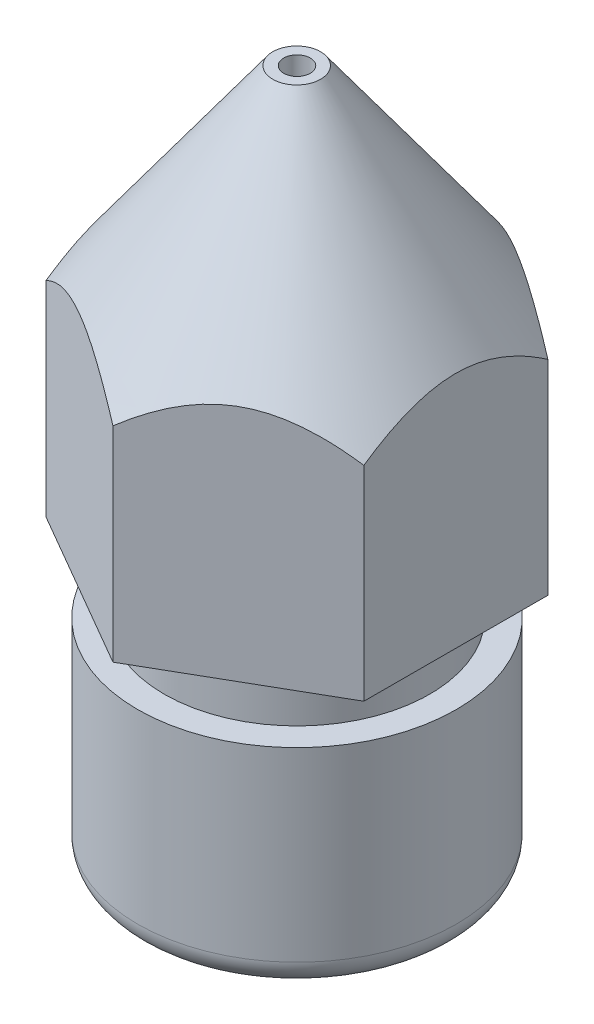
ISO-10303-21;
HEADER;
FILE_DESCRIPTION(('STEP AP214'),'2;1');
FILE_NAME('part.step','',(''),(''),'','','');
FILE_SCHEMA(('AUTOMOTIVE_DESIGN { 1 0 10303 214 1 1 1 1 }'));
ENDSEC;
DATA;
#1=APPLICATION_CONTEXT('core data for automotive mechanical design processes');
#2=APPLICATION_PROTOCOL_DEFINITION('international standard','automotive_design',2000,#1);
#3=PRODUCT_CONTEXT('',#1,'mechanical');
#4=PRODUCT('Part','Part','',(#3));
#5=PRODUCT_RELATED_PRODUCT_CATEGORY('part','',(#4));
#6=PRODUCT_DEFINITION_FORMATION('','',#4);
#7=PRODUCT_DEFINITION_CONTEXT('part definition',#1,'design');
#8=PRODUCT_DEFINITION('design','',#6,#7);
#9=PRODUCT_DEFINITION_SHAPE('','',#8);
#10=(LENGTH_UNIT() NAMED_UNIT(*) SI_UNIT(.MILLI.,.METRE.));
#11=(NAMED_UNIT(*) PLANE_ANGLE_UNIT() SI_UNIT($,.RADIAN.));
#12=(NAMED_UNIT(*) SI_UNIT($,.STERADIAN.) SOLID_ANGLE_UNIT());
#13=UNCERTAINTY_MEASURE_WITH_UNIT(LENGTH_MEASURE(1.E-05),#10,'distance_accuracy_value','');
#14=(GEOMETRIC_REPRESENTATION_CONTEXT(3) GLOBAL_UNCERTAINTY_ASSIGNED_CONTEXT((#13)) GLOBAL_UNIT_ASSIGNED_CONTEXT((#10,
#11,#12)) REPRESENTATION_CONTEXT('',''));
#15=CARTESIAN_POINT('',(0.,0.,0.));
#16=DIRECTION('',(0.,0.,1.));
#17=DIRECTION('',(1.,0.,0.));
#18=AXIS2_PLACEMENT_3D('',#15,#16,#17);
#19=CARTESIAN_POINT('',(-2.99360370897873,8.,-1.73491695293717));
#20=DIRECTION('',(0.999998652401006,0.,0.00164170526315273));
#21=DIRECTION('',(0.00164170526315273,0.,-0.999998652401006));
#22=AXIS2_PLACEMENT_3D('',#19,#20,#21);
#23=PLANE('',#22);
#24=DIRECTION('',(0.,-1.,0.));
#25=VECTOR('',#24,1.);
#26=CARTESIAN_POINT('',(-2.99928400918924,8.,1.72507838437032));
#27=LINE('',#26,#25);
#28=CARTESIAN_POINT('',(-2.99928400918924,3.86047640121463,1.72507838437032));
#29=VERTEX_POINT('',#28);
#30=CARTESIAN_POINT('',(-2.99928400918924,0.,1.72507838437032));
#31=VERTEX_POINT('',#30);
#32=EDGE_CURVE('E105',#29,#31,#27,.T.);
#33=ORIENTED_EDGE('',*,*,#32,.F.);
#34=CARTESIAN_POINT('',(-2.99928433753074,3.86033844854148,1.72527838437032));
#35=CARTESIAN_POINT('',(-2.99916196732492,3.91171394311012,1.65074001036501));
#36=CARTESIAN_POINT('',(-2.99903767415675,3.96148610351317,1.57503031785113));
#37=CARTESIAN_POINT('',(-2.99878439440269,4.05693383779429,1.42075206923493));
#38=CARTESIAN_POINT('',(-2.99865539426693,4.10259601480475,1.34217525961372));
#39=CARTESIAN_POINT('',(-2.99839003152426,4.18944362627375,1.18053699784877));
#40=CARTESIAN_POINT('',(-2.99825357396874,4.23052322601689,1.09741771042752));
#41=CARTESIAN_POINT('',(-2.99797571892827,4.30563377056149,0.928170116309737));
#42=CARTESIAN_POINT('',(-2.99783432761016,4.3396731705751,0.842045565978357));
#43=CARTESIAN_POINT('',(-2.99748526575783,4.41170138747353,0.629424342321209));
#44=CARTESIAN_POINT('',(-2.99727494700448,4.44522885295508,0.501314580691445));
#45=CARTESIAN_POINT('',(-2.99695583152763,4.47867661143214,0.306934350594162));
#46=CARTESIAN_POINT('',(-2.99684931534527,4.48701836542872,0.242053009705562));
#47=CARTESIAN_POINT('',(-2.9966354650866,4.49790218774536,0.111792130794857));
#48=CARTESIAN_POINT('',(-2.99652813106352,4.50044463038232,0.0464126252001419));
#49=CARTESIAN_POINT('',(-2.99631328690847,4.49959864630073,-0.0844536577726145));
#50=CARTESIAN_POINT('',(-2.99620577691863,4.49619695970321,-0.149940348576431));
#51=CARTESIAN_POINT('',(-2.99599169701284,4.48360647941934,-0.28034111057682));
#52=CARTESIAN_POINT('',(-2.99588512716476,4.47441727133541,-0.345255140432258));
#53=CARTESIAN_POINT('',(-2.99556600931188,4.43848348707277,-0.539636817826061));
#54=CARTESIAN_POINT('',(-2.99535590104619,4.40338935230215,-0.667618366810548));
#55=CARTESIAN_POINT('',(-2.99501154116324,4.32985662326248,-0.877375517877618));
#56=CARTESIAN_POINT('',(-2.99487444769295,4.2960453210109,-0.960882154920629));
#57=CARTESIAN_POINT('',(-2.99460493326128,4.22188764735797,-1.12504930143273));
#58=CARTESIAN_POINT('',(-2.99447251740218,4.18153439280243,-1.20570670299829));
#59=CARTESIAN_POINT('',(-2.99421487754598,4.09648315507799,-1.36264078537093));
#60=CARTESIAN_POINT('',(-2.99408956403016,4.0518841682177,-1.438971994));
#61=CARTESIAN_POINT('',(-2.99384336185241,3.95879877905163,-1.58893913578326));
#62=CARTESIAN_POINT('',(-2.99372246175059,3.9103236475861,-1.66258203722871));
#63=CARTESIAN_POINT('',(-2.99360338063724,3.86032558334046,-1.73511695293717));
#64=B_SPLINE_CURVE_WITH_KNOTS('',3,(#34,#35,#36,#37,#38,#39,#40,#41,#42,#43,#44,#45,#46,#47,#48,
#49,#50,#51,#52,#53,#54,#55,#56,#57,#58,#59,#60,#61,#62,#63),.UNSPECIFIED.,.F.,.F.,(4,2,2,2,2,2,
2,2,2,2,2,2,2,2,4),(0.,0.271643738950358,0.544143079042052,0.822007262643274,1.09953577099785,
1.49491928661063,1.69094610145264,1.88696026337387,2.08341224269272,2.27987828994745,
2.67614233177217,2.94616461375648,3.21647286749803,3.48155904967933,3.74590065712568),.UNSPECIFIED.);
#65=CARTESIAN_POINT('',(-2.99360370897873,3.86046353712789,-1.73491695293717));
#66=VERTEX_POINT('',#65);
#67=EDGE_CURVE('E98',#29,#66,#64,.T.);
#68=ORIENTED_EDGE('',*,*,#67,.T.);
#69=DIRECTION('',(0.,-1.,0.));
#70=VECTOR('',#69,1.);
#71=CARTESIAN_POINT('',(-2.99360370897873,8.,-1.73491695293717));
#72=LINE('',#71,#70);
#73=CARTESIAN_POINT('',(-2.99360370897873,0.,-1.73491695293717));
#74=VERTEX_POINT('',#73);
#75=EDGE_CURVE('E67',#66,#74,#72,.T.);
#76=ORIENTED_EDGE('',*,*,#75,.T.);
#77=DIRECTION('',(-0.00164170526315273,0.,0.999998652401006));
#78=VECTOR('',#77,1.);
#79=CARTESIAN_POINT('',(-2.99360370897873,0.,-1.73491695293717));
#80=LINE('',#79,#78);
#81=EDGE_CURVE('E106',#74,#31,#80,.T.);
#82=ORIENTED_EDGE('',*,*,#81,.T.);
#83=EDGE_LOOP('',(#33,#68,#76,#82));
#84=FACE_BOUND('',#83,.T.);
#85=ADVANCED_FACE('F43',(#84),#23,.F.);
#86=CARTESIAN_POINT('',(-2.99928400918924,8.,1.72507838437032));
#87=DIRECTION('',(0.50142108466392,0.,-0.8652033840979));
#88=DIRECTION('',(-0.8652033840979,0.,-0.50142108466392));
#89=AXIS2_PLACEMENT_3D('',#86,#87,#88);
#90=PLANE('',#89);
#91=DIRECTION('',(0.,-1.,0.));
#92=VECTOR('',#91,1.);
#93=CARTESIAN_POINT('',(-0.00568030021050791,8.,3.45999533730748));
#94=LINE('',#93,#92);
#95=CARTESIAN_POINT('',(-0.0056803002105078,3.85370164646345,3.45999533730748));
#96=VERTEX_POINT('',#95);
#97=CARTESIAN_POINT('',(-0.00568030021050791,0.,3.45999533730748));
#98=VERTEX_POINT('',#97);
#99=EDGE_CURVE('E124',#96,#98,#94,.T.);
#100=ORIENTED_EDGE('',*,*,#99,.F.);
#101=CARTESIAN_POINT('',(-0.00548030021050791,3.85354197372942,3.46011124556533));
#102=CARTESIAN_POINT('',(-0.070028430534204,3.90503676585917,3.42270293890032));
#103=CARTESIAN_POINT('',(-0.135589644430771,3.95493080769913,3.3847075084754));
#104=CARTESIAN_POINT('',(-0.26918561975504,4.05062877498785,3.30728312470039));
#105=CARTESIAN_POINT('',(-0.337227501214842,4.09641936660326,3.26785004499773));
#106=CARTESIAN_POINT('',(-0.477199787077993,4.18353796793565,3.18673032599251));
#107=CARTESIAN_POINT('',(-0.549180470158288,4.22475987101522,3.14501454812069));
#108=CARTESIAN_POINT('',(-0.695750398189047,4.30016279366352,3.06007122306779));
#109=CARTESIAN_POINT('',(-0.770336399055366,4.33435222828287,3.01684555596742));
#110=CARTESIAN_POINT('',(-0.954477355004354,4.40675112814688,2.91012826895719));
#111=CARTESIAN_POINT('',(-1.06543243471238,4.44050281819844,2.84582521901689));
#112=CARTESIAN_POINT('',(-1.23380410646683,4.47427944071376,2.74824688329896));
#113=CARTESIAN_POINT('',(-1.29000714555667,4.48272912449115,2.71567490156634));
#114=CARTESIAN_POINT('',(-1.40285229981434,4.49382220722695,2.65027647538479));
#115=CARTESIAN_POINT('',(-1.45949438615608,4.49646598419139,2.61745004764178));
#116=CARTESIAN_POINT('',(-1.57288478674166,4.49581163365098,2.55173562870041));
#117=CARTESIAN_POINT('',(-1.62963304058096,4.49249963164274,2.51884767250898));
#118=CARTESIAN_POINT('',(-1.74263977649679,4.48007235773911,2.45335560308496));
#119=CARTESIAN_POINT('',(-1.79889822337764,4.47095667224542,2.4207515102497));
#120=CARTESIAN_POINT('',(-1.96736588984063,4.43521712962939,2.32311754163463));
#121=CARTESIAN_POINT('',(-2.07829494006429,4.40021562008236,2.25882957685524));
#122=CARTESIAN_POINT('',(-2.25970827252633,4.32694006147513,2.15369306027717));
#123=CARTESIAN_POINT('',(-2.33170628464134,4.29335545736975,2.11196723951424));
#124=CARTESIAN_POINT('',(-2.47326102203411,4.21968730335707,2.0299304245094));
#125=CARTESIAN_POINT('',(-2.54281511714038,4.17959699772672,1.98962095456048));
#126=CARTESIAN_POINT('',(-2.67816502595343,4.09508205642632,1.91118009391016));
#127=CARTESIAN_POINT('',(-2.74400733557389,4.05075529652071,1.87302175690702));
#128=CARTESIAN_POINT('',(-2.87337522076163,3.95822430236718,1.7980477259407));
#129=CARTESIAN_POINT('',(-2.93690672870875,3.91003119158422,1.76122859391848));
#130=CARTESIAN_POINT('',(-2.99948400918924,3.86031740704726,1.72496247611247));
#131=B_SPLINE_CURVE_WITH_KNOTS('',3,(#101,#102,#103,#104,#105,#106,#107,#108,#109,#110,#111,
#112,#113,#114,#115,#116,#117,#118,#119,#120,#121,#122,#123,#124,#125,#126,#127,#128,#129,#130),
.UNSPECIFIED.,.F.,.F.,(4,2,2,2,2,2,2,2,2,2,2,2,2,2,4),(0.,0.272009967367018,0.544873980094565,
0.823131818723369,1.10105473180889,1.49699296322312,1.69329289617032,1.88958004821039,
2.086325060722,2.28308409579589,2.67992894083109,2.9488884582403,3.21812908017825,
3.48220588719126,3.74554846390116),.UNSPECIFIED.);
#132=EDGE_CURVE('E107',#96,#29,#131,.T.);
#133=ORIENTED_EDGE('',*,*,#132,.T.);
#134=ORIENTED_EDGE('',*,*,#32,.T.);
#135=DIRECTION('',(0.8652033840979,0.,0.50142108466392));
#136=VECTOR('',#135,1.);
#137=CARTESIAN_POINT('',(-2.99928400918924,0.,1.72507838437032));
#138=LINE('',#137,#136);
#139=EDGE_CURVE('E243',#31,#98,#138,.T.);
#140=ORIENTED_EDGE('',*,*,#139,.T.);
#141=EDGE_LOOP('',(#100,#133,#134,#140));
#142=FACE_BOUND('',#141,.T.);
#143=ADVANCED_FACE('F152',(#142),#90,.F.);
#144=CARTESIAN_POINT('',(-0.00568030021050791,8.,3.45999533730748));
#145=DIRECTION('',(-0.498577567737086,0.,-0.866845089361053));
#146=DIRECTION('',(-0.866845089361053,0.,0.498577567737086));
#147=AXIS2_PLACEMENT_3D('',#144,#145,#146);
#148=PLANE('',#147);
#149=DIRECTION('',(0.,-1.,0.));
#150=VECTOR('',#149,1.);
#151=CARTESIAN_POINT('',(2.99360370897873,8.,1.73491695293716));
#152=LINE('',#151,#150);
#153=CARTESIAN_POINT('',(2.99360370897873,3.84692368025163,1.73491695293716));
#154=VERTEX_POINT('',#153);
#155=CARTESIAN_POINT('',(2.99360370897873,0.,1.73491695293716));
#156=VERTEX_POINT('',#155);
#157=EDGE_CURVE('E122',#154,#156,#152,.T.);
#158=ORIENTED_EDGE('',*,*,#157,.F.);
#159=CARTESIAN_POINT('',(2.99380370897873,3.84676453538978,1.73480192025743));
#160=CARTESIAN_POINT('',(2.92900575210707,3.89828772383083,1.77207133336008));
#161=CARTESIAN_POINT('',(2.86318954166741,3.94820302709815,1.80992640864564));
#162=CARTESIAN_POINT('',(2.72907183739772,4.04392539690487,1.88706600325827));
#163=CARTESIAN_POINT('',(2.66076316878563,4.0897190289211,1.92635464925739));
#164=CARTESIAN_POINT('',(2.5202488462862,4.1768158122958,2.00717334455118));
#165=CARTESIAN_POINT('',(2.44799297536457,4.21801295658777,2.04873227684597));
#166=CARTESIAN_POINT('',(2.30086548401587,4.29333884862904,2.13335462481124));
#167=CARTESIAN_POINT('',(2.22599712888708,4.32747607496498,2.17641616240165));
#168=CARTESIAN_POINT('',(2.04116469041631,4.39971207285934,2.28272501590118));
#169=CARTESIAN_POINT('',(1.92979832127418,4.43333698135214,2.34677887527705));
#170=CARTESIAN_POINT('',(1.76082124649981,4.46688372383056,2.44396830390545));
#171=CARTESIAN_POINT('',(1.70441822473081,4.47525060312185,2.47640925760265));
#172=CARTESIAN_POINT('',(1.59117899037932,4.48616802706839,2.54154032049763));
#173=CARTESIAN_POINT('',(1.5343428059967,4.4887189471646,2.57423041347587));
#174=CARTESIAN_POINT('',(1.42057579316376,4.48787282556438,2.63966503523599));
#175=CARTESIAN_POINT('',(1.36364504049381,4.4844623512676,2.67240952043178));
#176=CARTESIAN_POINT('',(1.25028135918194,4.47183733782787,2.73761216066344));
#177=CARTESIAN_POINT('',(1.19384846640334,4.46262238396582,2.77007029507205));
#178=CARTESIAN_POINT('',(1.02487012846659,4.42658832929142,2.86726045022522));
#179=CARTESIAN_POINT('',(0.913616069712732,4.39139654122133,2.93124971277646));
#180=CARTESIAN_POINT('',(0.732102038849708,4.31799296895117,3.03564993967807));
#181=CARTESIAN_POINT('',(0.660307708916944,4.28451074702711,3.07694341048907));
#182=CARTESIAN_POINT('',(0.519139307136593,4.21112319329572,3.15813830824509));
#183=CARTESIAN_POINT('',(0.449767777876186,4.17121134665984,3.19803827278703));
#184=CARTESIAN_POINT('',(0.314751057449613,4.08709753501789,3.27569494858793));
#185=CARTESIAN_POINT('',(0.249060026629975,4.04299193142097,3.31347802513779));
#186=CARTESIAN_POINT('',(0.119973837191925,3.95093495182471,3.38772367657928));
#187=CARTESIAN_POINT('',(0.056572912749971,3.90299437751896,3.42418956776159));
#188=CARTESIAN_POINT('',(-0.00588030021050773,3.85354317984692,3.46011036998722));
#189=B_SPLINE_CURVE_WITH_KNOTS('',3,(#159,#160,#161,#162,#163,#164,#165,#166,#167,#168,#169,
#170,#171,#172,#173,#174,#175,#176,#177,#178,#179,#180,#181,#182,#183,#184,#185,#186,#187,#188),
.UNSPECIFIED.,.F.,.F.,(4,2,2,2,2,2,2,2,2,2,2,2,2,2,4),(0.,0.272421514922281,0.545701052462781,
0.824354319672369,1.10267097049094,1.4991775487318,1.69576555176471,1.89234086397987,
2.08935968359733,2.28639258143396,2.68377412008408,2.95153275833444,3.21956442997652,
3.48248315533902,3.74468578415281),.UNSPECIFIED.);
#190=EDGE_CURVE('E212',#154,#96,#189,.T.);
#191=ORIENTED_EDGE('',*,*,#190,.T.);
#192=ORIENTED_EDGE('',*,*,#99,.T.);
#193=DIRECTION('',(0.866845089361053,0.,-0.498577567737086));
#194=VECTOR('',#193,1.);
#195=CARTESIAN_POINT('',(-0.00568030021050791,0.,3.45999533730748));
#196=LINE('',#195,#194);
#197=EDGE_CURVE('E244',#98,#156,#196,.T.);
#198=ORIENTED_EDGE('',*,*,#197,.T.);
#199=EDGE_LOOP('',(#158,#191,#192,#198));
#200=FACE_BOUND('',#199,.T.);
#201=ADVANCED_FACE('F157',(#200),#148,.F.);
#202=CARTESIAN_POINT('',(2.99360370897873,8.,1.73491695293716));
#203=DIRECTION('',(-0.999998652401006,0.,-0.00164170526315286));
#204=DIRECTION('',(-0.00164170526315286,0.,0.999998652401006));
#205=AXIS2_PLACEMENT_3D('',#202,#203,#204);
#206=PLANE('',#205);
#207=DIRECTION('',(0.,-1.,0.));
#208=VECTOR('',#207,1.);
#209=CARTESIAN_POINT('',(2.99928400918924,8.,-1.72507838437032));
#210=LINE('',#209,#208);
#211=CARTESIAN_POINT('',(2.99928400918924,3.84691085269213,-1.72507838437032));
#212=VERTEX_POINT('',#211);
#213=CARTESIAN_POINT('',(2.99928400918924,0.,-1.72507838437032));
#214=VERTEX_POINT('',#213);
#215=EDGE_CURVE('E115',#212,#214,#210,.T.);
#216=ORIENTED_EDGE('',*,*,#215,.F.);
#217=CARTESIAN_POINT('',(2.99928433753074,3.84677329060856,-1.72527838437032));
#218=CARTESIAN_POINT('',(2.99916148443503,3.89820547781602,-1.65044587155336));
#219=CARTESIAN_POINT('',(2.99903669606908,3.94802001471041,-1.57443454321443));
#220=CARTESIAN_POINT('',(2.99878239929559,4.04351615679581,-1.41953680578203));
#221=CARTESIAN_POINT('',(2.9986528771822,4.08918416304675,-1.34064204814536));
#222=CARTESIAN_POINT('',(2.99838646677774,4.17598748457118,-1.17836563262205));
#223=CARTESIAN_POINT('',(2.99824948414648,4.21701718192057,-1.09492651005879));
#224=CARTESIAN_POINT('',(2.99797057070069,4.29197288431364,-0.925034218071113));
#225=CARTESIAN_POINT('',(2.99782864610963,4.32590747199251,-0.838584839500404));
#226=CARTESIAN_POINT('',(2.99747828745966,4.39760940416004,-0.625173707983022));
#227=CARTESIAN_POINT('',(2.99726720713237,4.43088311091715,-0.496600054976437));
#228=CARTESIAN_POINT('',(2.99694700713983,4.4638710099451,-0.301559222601419));
#229=CARTESIAN_POINT('',(2.99684013691818,4.4720471460666,-0.236462228625682));
#230=CARTESIAN_POINT('',(2.99662560404858,4.4825797182801,-0.105785556441358));
#231=CARTESIAN_POINT('',(2.99651794145132,4.48493652349097,-0.0402059091120318));
#232=CARTESIAN_POINT('',(2.99630248468628,4.48370727315402,0.0910335280341329));
#233=CARTESIAN_POINT('',(2.99619469071106,4.48010883793801,0.156693200554096));
#234=CARTESIAN_POINT('',(2.99598006968698,4.4671232855758,0.287423569560417));
#235=CARTESIAN_POINT('',(2.99587324270825,4.45773575195998,0.35249422333081));
#236=CARTESIAN_POINT('',(2.99555339910957,4.42121352814261,0.54731796839547));
#237=CARTESIAN_POINT('',(2.99534285528393,4.38573913226365,0.675564826486311));
#238=CARTESIAN_POINT('',(2.99499941828758,4.31195236633105,0.884759827100979));
#239=CARTESIAN_POINT('',(2.99486361577613,4.27834787697069,0.967480112827471));
#240=CARTESIAN_POINT('',(2.99459658563699,4.20475546970431,1.13013402232446));
#241=CARTESIAN_POINT('',(2.99446536275961,4.1647611503495,1.21006475257754));
#242=CARTESIAN_POINT('',(2.99420995999332,4.08051579664291,1.36563617446392));
#243=CARTESIAN_POINT('',(2.9940856934378,4.03636070418735,1.44132965662777));
#244=CARTESIAN_POINT('',(2.99384148948096,3.94422632860382,1.59007963826641));
#245=CARTESIAN_POINT('',(2.99372154131362,3.89625767403018,1.66314269555725));
#246=CARTESIAN_POINT('',(2.99360338063724,3.84678611928128,1.73511695293716));
#247=B_SPLINE_CURVE_WITH_KNOTS('',3,(#217,#218,#219,#220,#221,#222,#223,#224,#225,#226,#227,
#228,#229,#230,#231,#232,#233,#234,#235,#236,#237,#238,#239,#240,#241,#242,#243,#244,#245,#246),
.UNSPECIFIED.,.F.,.F.,(4,2,2,2,2,2,2,2,2,2,2,2,2,2,4),(0.,0.27246781787684,0.545799172871012,
0.824454652288463,1.10277107919303,1.49929545175813,1.69590057911425,1.89249323553048,
2.08949507949232,2.28651109748441,2.68385283480933,2.95146812279911,3.21935321348763,
3.48211946169567,3.7441774474265),.UNSPECIFIED.);
#248=EDGE_CURVE('E206',#212,#154,#247,.T.);
#249=ORIENTED_EDGE('',*,*,#248,.T.);
#250=ORIENTED_EDGE('',*,*,#157,.T.);
#251=DIRECTION('',(0.00164170526315286,0.,-0.999998652401006));
#252=VECTOR('',#251,1.);
#253=CARTESIAN_POINT('',(2.99360370897873,0.,1.73491695293716));
#254=LINE('',#253,#252);
#255=EDGE_CURVE('E247',#156,#214,#254,.T.);
#256=ORIENTED_EDGE('',*,*,#255,.T.);
#257=EDGE_LOOP('',(#216,#249,#250,#256));
#258=FACE_BOUND('',#257,.T.);
#259=ADVANCED_FACE('F220',(#258),#206,.F.);
#260=CARTESIAN_POINT('',(2.99928400918924,8.,-1.72507838437032));
#261=DIRECTION('',(-0.50142108466392,0.,0.8652033840979));
#262=DIRECTION('',(0.8652033840979,0.,0.50142108466392));
#263=AXIS2_PLACEMENT_3D('',#260,#261,#262);
#264=PLANE('',#263);
#265=DIRECTION('',(0.,-1.,0.));
#266=VECTOR('',#265,1.);
#267=CARTESIAN_POINT('',(0.00568030021050907,8.,-3.45999533730748));
#268=LINE('',#267,#266);
#269=CARTESIAN_POINT('',(0.00568030021050907,3.85367595489511,-3.45999533730748));
#270=VERTEX_POINT('',#269);
#271=CARTESIAN_POINT('',(0.00568030021050907,0.,-3.45999533730748));
#272=VERTEX_POINT('',#271);
#273=EDGE_CURVE('E113',#270,#272,#268,.T.);
#274=ORIENTED_EDGE('',*,*,#273,.F.);
#275=CARTESIAN_POINT('',(0.00548030021050907,3.85351718757397,-3.46011124556533));
#276=CARTESIAN_POINT('',(0.0701687375371599,3.9048312847969,-3.42262162519894));
#277=CARTESIAN_POINT('',(0.135877416787921,3.95452517835206,-3.38454073251253));
#278=CARTESIAN_POINT('',(0.269782192646824,4.04977365330201,-3.30693738607757));
#279=CARTESIAN_POINT('',(0.337985532774358,4.09531457345514,-3.26741073441045));
#280=CARTESIAN_POINT('',(0.478265799399972,4.18184975834371,-3.18611252783709));
#281=CARTESIAN_POINT('',(0.550392202175507,4.22273868995759,-3.14431229938523));
#282=CARTESIAN_POINT('',(0.697247563762876,4.29740534503687,-3.05920355380095));
#283=CARTESIAN_POINT('',(0.771973237158301,4.33119169074862,-3.01589694070299));
#284=CARTESIAN_POINT('',(0.956438105759044,4.40252807110269,-2.90899193293697));
#285=CARTESIAN_POINT('',(1.067567471221,4.43558092472528,-2.84458787720613));
#286=CARTESIAN_POINT('',(1.23612609642327,4.46824536259874,-2.74690119424602));
#287=CARTESIAN_POINT('',(1.29238141932863,4.47631541352599,-2.71429891188356));
#288=CARTESIAN_POINT('',(1.40530178362981,4.48664247953031,-2.64885689837644));
#289=CARTESIAN_POINT('',(1.46196679904564,4.48889986002204,-2.61601718228826));
#290=CARTESIAN_POINT('',(1.57535303467751,4.487482821756,-2.55030517710953));
#291=CARTESIAN_POINT('',(1.63207414334706,4.48379662511239,-2.51743295266478));
#292=CARTESIAN_POINT('',(1.74500129643194,4.47065153285238,-2.4519870047772));
#293=CARTESIAN_POINT('',(1.80120730333827,4.46119222018303,-2.41941330307239));
#294=CARTESIAN_POINT('',(1.96948552507315,4.42448055773866,-2.32188912549928));
#295=CARTESIAN_POINT('',(2.08024916967987,4.3889161358026,-2.25769702010439));
#296=CARTESIAN_POINT('',(2.26132572907487,4.31487193223989,-2.15275567742376));
#297=CARTESIAN_POINT('',(2.33315570852978,4.28103810000573,-2.1111272385253));
#298=CARTESIAN_POINT('',(2.47438318063662,4.20694988283519,-2.02928008726619));
#299=CARTESIAN_POINT('',(2.54377811180581,4.16668897031007,-1.98906285939055));
#300=CARTESIAN_POINT('',(2.67882396617567,4.08189914328961,-1.91079821084424));
#301=CARTESIAN_POINT('',(2.74452124313272,4.03746728945272,-1.87272392625783));
#302=CARTESIAN_POINT('',(2.87361870453504,3.94476872202637,-1.79790661704076));
#303=CARTESIAN_POINT('',(2.93702465896928,3.89651278469559,-1.76116024846325));
#304=CARTESIAN_POINT('',(2.99948400918924,3.84675140712665,-1.72496247611247));
#305=B_SPLINE_CURVE_WITH_KNOTS('',3,(#275,#276,#277,#278,#279,#280,#281,#282,#283,#284,#285,
#286,#287,#288,#289,#290,#291,#292,#293,#294,#295,#296,#297,#298,#299,#300,#301,#302,#303,#304),
.UNSPECIFIED.,.F.,.F.,(4,2,2,2,2,2,2,2,2,2,2,2,2,2,4),(0.,0.272104563109087,0.545074156382199,
0.82333885069935,1.10126376715198,1.49724093262273,1.69357668988459,1.88990010415918,
2.08661303434878,2.28334017686645,2.68010936898421,2.94881581567372,3.21779692785262,
3.48160096565517,3.74468637482334),.UNSPECIFIED.);
#306=EDGE_CURVE('E59',#270,#212,#305,.T.);
#307=ORIENTED_EDGE('',*,*,#306,.T.);
#308=ORIENTED_EDGE('',*,*,#215,.T.);
#309=DIRECTION('',(-0.8652033840979,0.,-0.50142108466392));
#310=VECTOR('',#309,1.);
#311=CARTESIAN_POINT('',(2.99928400918924,0.,-1.72507838437032));
#312=LINE('',#311,#310);
#313=EDGE_CURVE('E117',#214,#272,#312,.T.);
#314=ORIENTED_EDGE('',*,*,#313,.T.);
#315=EDGE_LOOP('',(#274,#307,#308,#314));
#316=FACE_BOUND('',#315,.T.);
#317=ADVANCED_FACE('F224',(#316),#264,.F.);
#318=CARTESIAN_POINT('',(0.00568030021050907,8.,-3.45999533730748));
#319=DIRECTION('',(0.498577567737086,0.,0.866845089361053));
#320=DIRECTION('',(0.866845089361053,0.,-0.498577567737086));
#321=AXIS2_PLACEMENT_3D('',#318,#319,#320);
#322=PLANE('',#321);
#323=ORIENTED_EDGE('',*,*,#75,.F.);
#324=CARTESIAN_POINT('',(-2.99380370897873,3.86030484537906,-1.73480192025743));
#325=CARTESIAN_POINT('',(-2.92912014998105,3.91159064613409,-1.77200553589008));
#326=CARTESIAN_POINT('',(-2.86341766417013,3.96126342426315,-1.80979520093166));
#327=CARTESIAN_POINT('',(-2.72952757068096,4.05648789258607,-1.88680388215419));
#328=CARTESIAN_POINT('',(-2.66133274686644,4.1020260229103,-1.9260270487926));
#329=CARTESIAN_POINT('',(-2.52106303733564,4.18858367598292,-2.00670505166));
#330=CARTESIAN_POINT('',(-2.44893841731677,4.22949774846054,-2.04818849323948));
#331=CARTESIAN_POINT('',(-2.3020838036719,4.30424220885869,-2.13265389193718));
#332=CARTESIAN_POINT('',(-2.22735708685991,4.33808115514574,-2.17563396435192));
#333=CARTESIAN_POINT('',(-2.04288484709516,4.40958091354108,-2.28173564473949));
#334=CARTESIAN_POINT('',(-1.93174598173318,4.4427607427981,-2.34565865226795));
#335=CARTESIAN_POINT('',(-1.76315423733725,4.47565515903596,-2.44262645296627));
#336=CARTESIAN_POINT('',(-1.70688576998997,4.48380802321402,-2.47499001588496));
#337=CARTESIAN_POINT('',(-1.5939316108293,4.49431068102019,-2.53995711396431));
#338=CARTESIAN_POINT('',(-1.53724594570611,4.49666084269427,-2.57256063377373));
#339=CARTESIAN_POINT('',(-1.42380657256319,4.49543530221343,-2.63780680917619));
#340=CARTESIAN_POINT('',(-1.36705296489644,4.49184738387971,-2.67044940704988));
#341=CARTESIAN_POINT('',(-1.25405473511966,4.47889962883859,-2.73544185293456));
#342=CARTESIAN_POINT('',(-1.19781014999925,4.4695393760309,-2.76779167967048));
#343=CARTESIAN_POINT('',(-1.02940481866511,4.43312164951065,-2.86465226239862));
#344=CARTESIAN_POINT('',(-0.918546458808622,4.39774721617198,-2.92841393342719));
#345=CARTESIAN_POINT('',(-0.736882536787239,4.32382905555137,-3.03290037223687));
#346=CARTESIAN_POINT('',(-0.664574912085931,4.28989080099053,-3.07448907141148));
#347=CARTESIAN_POINT('',(-0.522422653917926,4.21551792549793,-3.15624984735125));
#348=CARTESIAN_POINT('',(-0.45258068008499,4.17507653609841,-3.19642039439242));
#349=CARTESIAN_POINT('',(-0.316687379858633,4.08988194921227,-3.2745812468102));
#350=CARTESIAN_POINT('',(-0.250588850190694,4.04522735252487,-3.3125987017826));
#351=CARTESIAN_POINT('',(-0.120718517810721,3.95205177498737,-3.38729536354364));
#352=CARTESIAN_POINT('',(-0.0569407561085322,3.90354189099687,-3.42397799772529));
#353=CARTESIAN_POINT('',(0.00588030021050923,3.85351658458047,-3.46011036998722));
#354=B_SPLINE_CURVE_WITH_KNOTS('',3,(#324,#325,#326,#327,#328,#329,#330,#331,#332,#333,#334,
#335,#336,#337,#338,#339,#340,#341,#342,#343,#344,#345,#346,#347,#348,#349,#350,#351,#352,#353),
.UNSPECIFIED.,.F.,.F.,(4,2,2,2,2,2,2,2,2,2,2,2,2,2,4),(0.,0.271692038552243,0.544245148801399,
0.82211397773886,1.09964471511733,1.49504938795877,1.69109491255205,1.8871280023154,
2.08356488477794,2.28001592910142,2.67624413612174,2.94615669359014,3.21635201651248,
3.48131790383246,3.74554697972579),.UNSPECIFIED.);
#355=EDGE_CURVE('E96',#66,#270,#354,.T.);
#356=ORIENTED_EDGE('',*,*,#355,.T.);
#357=ORIENTED_EDGE('',*,*,#273,.T.);
#358=DIRECTION('',(-0.866845089361053,0.,0.498577567737086));
#359=VECTOR('',#358,1.);
#360=CARTESIAN_POINT('',(0.00568030021050907,0.,-3.45999533730748));
#361=LINE('',#360,#359);
#362=EDGE_CURVE('E111',#272,#74,#361,.T.);
#363=ORIENTED_EDGE('',*,*,#362,.T.);
#364=EDGE_LOOP('',(#323,#356,#357,#363));
#365=FACE_BOUND('',#364,.T.);
#366=ADVANCED_FACE('F109',(#365),#322,.F.);
#367=CARTESIAN_POINT('',(0.,0.,0.));
#368=DIRECTION('',(0.,1.,0.));
#369=DIRECTION('',(0.,0.,1.));
#370=AXIS2_PLACEMENT_3D('',#367,#368,#369);
#371=PLANE('',#370);
#372=CARTESIAN_POINT('',(0.,0.,0.));
#373=DIRECTION('',(0.,-1.,0.));
#374=DIRECTION('',(0.,0.,-1.));
#375=AXIS2_PLACEMENT_3D('',#372,#373,#374);
#376=CIRCLE('',#375,2.5);
#377=CARTESIAN_POINT('',(0.,0.,-2.5));
#378=VERTEX_POINT('',#377);
#379=EDGE_CURVE('E127',#378,#378,#376,.T.);
#380=ORIENTED_EDGE('',*,*,#379,.F.);
#381=EDGE_LOOP('',(#380));
#382=FACE_BOUND('',#381,.T.);
#383=ORIENTED_EDGE('',*,*,#81,.F.);
#384=ORIENTED_EDGE('',*,*,#362,.F.);
#385=ORIENTED_EDGE('',*,*,#313,.F.);
#386=ORIENTED_EDGE('',*,*,#255,.F.);
#387=ORIENTED_EDGE('',*,*,#197,.F.);
#388=ORIENTED_EDGE('',*,*,#139,.F.);
#389=EDGE_LOOP('',(#383,#384,#385,#386,#387,#388));
#390=FACE_BOUND('',#389,.T.);
#391=ADVANCED_FACE('F183',(#382,#390),#371,.F.);
#392=CARTESIAN_POINT('',(-0.00568030021050791,2.85,0.));
#393=DIRECTION('',(0.,-1.,0.));
#394=DIRECTION('',(0.,0.,-1.));
#395=AXIS2_PLACEMENT_3D('',#392,#393,#394);
#396=CONICAL_SURFACE('',#395,4.18863013835261,0.627929034903158);
#397=CARTESIAN_POINT('',(-0.00568030021050791,8.,0.));
#398=DIRECTION('',(0.,1.,0.));
#399=DIRECTION('',(0.,0.,1.));
#400=AXIS2_PLACEMENT_3D('',#397,#398,#399);
#401=CIRCLE('',#400,0.45);
#402=CARTESIAN_POINT('',(-0.00568030021050791,8.,0.45));
#403=VERTEX_POINT('',#402);
#404=EDGE_CURVE('E102',#403,#403,#401,.T.);
#405=ORIENTED_EDGE('',*,*,#404,.F.);
#406=EDGE_LOOP('',(#405));
#407=FACE_BOUND('',#406,.T.);
#408=ORIENTED_EDGE('',*,*,#132,.F.);
#409=ORIENTED_EDGE('',*,*,#190,.F.);
#410=ORIENTED_EDGE('',*,*,#248,.F.);
#411=ORIENTED_EDGE('',*,*,#306,.F.);
#412=ORIENTED_EDGE('',*,*,#355,.F.);
#413=ORIENTED_EDGE('',*,*,#67,.F.);
#414=EDGE_LOOP('',(#408,#409,#410,#411,#412,#413));
#415=FACE_BOUND('',#414,.T.);
#416=ADVANCED_FACE('F97',(#407,#415),#396,.T.);
#417=CARTESIAN_POINT('',(0.,8.,0.));
#418=DIRECTION('',(0.,1.,0.));
#419=DIRECTION('',(0.,0.,1.));
#420=AXIS2_PLACEMENT_3D('',#417,#418,#419);
#421=PLANE('',#420);
#422=CARTESIAN_POINT('',(0.,8.,0.));
#423=DIRECTION('',(0.,1.,0.));
#424=DIRECTION('',(0.,0.,1.));
#425=AXIS2_PLACEMENT_3D('',#422,#423,#424);
#426=CIRCLE('',#425,0.25);
#427=CARTESIAN_POINT('',(0.,8.,0.25));
#428=VERTEX_POINT('',#427);
#429=EDGE_CURVE('E269',#428,#428,#426,.T.);
#430=ORIENTED_EDGE('',*,*,#429,.F.);
#431=EDGE_LOOP('',(#430));
#432=FACE_BOUND('',#431,.T.);
#433=ORIENTED_EDGE('',*,*,#404,.T.);
#434=EDGE_LOOP('',(#433));
#435=FACE_BOUND('',#434,.T.);
#436=ADVANCED_FACE('F182',(#432,#435),#421,.T.);
#437=CARTESIAN_POINT('',(0.,-1.,0.));
#438=DIRECTION('',(0.,1.,0.));
#439=DIRECTION('',(0.,0.,1.));
#440=AXIS2_PLACEMENT_3D('',#437,#438,#439);
#441=CYLINDRICAL_SURFACE('',#440,2.5);
#442=CARTESIAN_POINT('',(0.,-1.,0.));
#443=DIRECTION('',(0.,-1.,0.));
#444=DIRECTION('',(0.,0.,-1.));
#445=AXIS2_PLACEMENT_3D('',#442,#443,#444);
#446=CIRCLE('',#445,2.5);
#447=CARTESIAN_POINT('',(0.,-1.,-2.5));
#448=VERTEX_POINT('',#447);
#449=EDGE_CURVE('E259',#448,#448,#446,.T.);
#450=ORIENTED_EDGE('',*,*,#449,.F.);
#451=EDGE_LOOP('',(#450));
#452=FACE_BOUND('',#451,.T.);
#453=ORIENTED_EDGE('',*,*,#379,.T.);
#454=EDGE_LOOP('',(#453));
#455=FACE_BOUND('',#454,.T.);
#456=ADVANCED_FACE('F185',(#452,#455),#441,.T.);
#457=CARTESIAN_POINT('',(0.,-5.,0.));
#458=DIRECTION('',(0.,1.,0.));
#459=DIRECTION('',(0.,0.,1.));
#460=AXIS2_PLACEMENT_3D('',#457,#458,#459);
#461=CYLINDRICAL_SURFACE('',#460,3.);
#462=CARTESIAN_POINT('',(0.,-4.5,0.));
#463=DIRECTION('',(0.,-1.,0.));
#464=DIRECTION('',(0.,0.,-1.));
#465=AXIS2_PLACEMENT_3D('',#462,#463,#464);
#466=CIRCLE('',#465,3.);
#467=CARTESIAN_POINT('',(0.,-4.5,-3.));
#468=VERTEX_POINT('',#467);
#469=EDGE_CURVE('E131',#468,#468,#466,.F.);
#470=ORIENTED_EDGE('',*,*,#469,.T.);
#471=EDGE_LOOP('',(#470));
#472=FACE_BOUND('',#471,.T.);
#473=CARTESIAN_POINT('',(0.,-1.,0.));
#474=DIRECTION('',(0.,-1.,0.));
#475=DIRECTION('',(0.,0.,-1.));
#476=AXIS2_PLACEMENT_3D('',#473,#474,#475);
#477=CIRCLE('',#476,3.);
#478=CARTESIAN_POINT('',(0.,-1.,-3.));
#479=VERTEX_POINT('',#478);
#480=EDGE_CURVE('E265',#479,#479,#477,.T.);
#481=ORIENTED_EDGE('',*,*,#480,.T.);
#482=EDGE_LOOP('',(#481));
#483=FACE_BOUND('',#482,.T.);
#484=ADVANCED_FACE('F282',(#472,#483),#461,.T.);
#485=CARTESIAN_POINT('',(0.,-5.,0.));
#486=DIRECTION('',(0.,-1.,0.));
#487=DIRECTION('',(0.,0.,-1.));
#488=AXIS2_PLACEMENT_3D('',#485,#486,#487);
#489=PLANE('',#488);
#490=CARTESIAN_POINT('',(0.,-5.,0.));
#491=DIRECTION('',(0.,-1.,0.));
#492=DIRECTION('',(0.,0.,-1.));
#493=AXIS2_PLACEMENT_3D('',#490,#491,#492);
#494=CIRCLE('',#493,1.58359175109897);
#495=CARTESIAN_POINT('',(0.,-5.,-1.58359175109897));
#496=VERTEX_POINT('',#495);
#497=EDGE_CURVE('E52',#496,#496,#494,.F.);
#498=ORIENTED_EDGE('',*,*,#497,.T.);
#499=EDGE_LOOP('',(#498));
#500=FACE_BOUND('',#499,.T.);
#501=CARTESIAN_POINT('',(0.,-5.,0.));
#502=DIRECTION('',(0.,-1.,0.));
#503=DIRECTION('',(0.,0.,-1.));
#504=AXIS2_PLACEMENT_3D('',#501,#502,#503);
#505=CIRCLE('',#504,2.5);
#506=CARTESIAN_POINT('',(0.,-5.,-2.5));
#507=VERTEX_POINT('',#506);
#508=EDGE_CURVE('E128',#507,#507,#505,.T.);
#509=ORIENTED_EDGE('',*,*,#508,.T.);
#510=EDGE_LOOP('',(#509));
#511=FACE_BOUND('',#510,.T.);
#512=ADVANCED_FACE('F139',(#500,#511),#489,.T.);
#513=CARTESIAN_POINT('',(0.,-1.,0.));
#514=DIRECTION('',(0.,-1.,0.));
#515=DIRECTION('',(0.,0.,-1.));
#516=AXIS2_PLACEMENT_3D('',#513,#514,#515);
#517=PLANE('',#516);
#518=ORIENTED_EDGE('',*,*,#449,.T.);
#519=EDGE_LOOP('',(#518));
#520=FACE_BOUND('',#519,.T.);
#521=ORIENTED_EDGE('',*,*,#480,.F.);
#522=EDGE_LOOP('',(#521));
#523=FACE_BOUND('',#522,.T.);
#524=ADVANCED_FACE('F292',(#520,#523),#517,.F.);
#525=CARTESIAN_POINT('',(0.,-4.5,0.));
#526=DIRECTION('',(0.,-1.,0.));
#527=DIRECTION('',(0.,0.,-1.));
#528=AXIS2_PLACEMENT_3D('',#525,#526,#527);
#529=TOROIDAL_SURFACE('',#528,2.5,0.5);
#530=ORIENTED_EDGE('',*,*,#469,.F.);
#531=EDGE_LOOP('',(#530));
#532=FACE_BOUND('',#531,.T.);
#533=ORIENTED_EDGE('',*,*,#508,.F.);
#534=EDGE_LOOP('',(#533));
#535=FACE_BOUND('',#534,.T.);
#536=ADVANCED_FACE('F164',(#532,#535),#529,.T.);
#537=CARTESIAN_POINT('',(0.,-92.,0.));
#538=DIRECTION('',(0.,1.,0.));
#539=DIRECTION('',(0.,0.,1.));
#540=AXIS2_PLACEMENT_3D('',#537,#538,#539);
#541=CYLINDRICAL_SURFACE('',#540,0.25);
#542=CARTESIAN_POINT('',(0.,-0.668524125715844,0.));
#543=DIRECTION('',(0.,-1.,0.));
#544=DIRECTION('',(0.,0.,-1.));
#545=AXIS2_PLACEMENT_3D('',#542,#543,#544);
#546=CIRCLE('',#545,0.25);
#547=CARTESIAN_POINT('',(0.,-0.668524125715844,-0.25));
#548=VERTEX_POINT('',#547);
#549=EDGE_CURVE('E134',#548,#548,#546,.T.);
#550=ORIENTED_EDGE('',*,*,#549,.T.);
#551=EDGE_LOOP('',(#550));
#552=FACE_BOUND('',#551,.T.);
#553=ORIENTED_EDGE('',*,*,#429,.T.);
#554=EDGE_LOOP('',(#553));
#555=FACE_BOUND('',#554,.T.);
#556=ADVANCED_FACE('F148',(#552,#555),#541,.F.);
#557=CARTESIAN_POINT('',(0.,-0.668524125715844,0.));
#558=DIRECTION('',(0.,-1.,0.));
#559=DIRECTION('',(0.,0.,-1.));
#560=AXIS2_PLACEMENT_3D('',#557,#558,#559);
#561=CONICAL_SURFACE('',#560,0.25,0.226892802759263);
#562=CARTESIAN_POINT('',(0.,-4.7564074838037,0.));
#563=DIRECTION('',(0.,1.,0.));
#564=DIRECTION('',(0.,0.,1.));
#565=AXIS2_PLACEMENT_3D('',#562,#563,#564);
#566=CIRCLE('',#565,1.19376223641404);
#567=CARTESIAN_POINT('',(0.,-4.7564074838037,-1.19376223641404));
#568=VERTEX_POINT('',#567);
#569=EDGE_CURVE('E11',#568,#568,#566,.F.);
#570=CARTESIAN_POINT('',(0.,-4.7564074838037,-1.19376223641404));
#571=CARTESIAN_POINT('',(0.,-4.71382536549028,-1.18393137978472));
#572=CARTESIAN_POINT('',(0.,-4.67124324717687,-1.17410052315541));
#573=CARTESIAN_POINT('',(0.,-4.58607901055004,-1.15443880989678));
#574=CARTESIAN_POINT('',(0.,-4.54349689223662,-1.14460795326747));
#575=CARTESIAN_POINT('',(0.,-4.45833265560979,-1.12494624000885));
#576=CARTESIAN_POINT('',(0.,-4.41575053729638,-1.11511538337953));
#577=CARTESIAN_POINT('',(0.,-4.33058630066955,-1.09545367012091));
#578=CARTESIAN_POINT('',(0.,-4.28800418235613,-1.08562281349159));
#579=CARTESIAN_POINT('',(0.,-4.2028399457293,-1.06596110023297));
#580=CARTESIAN_POINT('',(0.,-4.16025782741589,-1.05613024360366));
#581=CARTESIAN_POINT('',(0.,-4.07509359078906,-1.03646853034503));
#582=CARTESIAN_POINT('',(0.,-4.03251147247564,-1.02663767371572));
#583=CARTESIAN_POINT('',(0.,-3.94734723584881,-1.00697596045709));
#584=CARTESIAN_POINT('',(0.,-3.90476511753539,-0.997145103827778));
#585=CARTESIAN_POINT('',(0.,-3.81960088090856,-0.977483390569153));
#586=CARTESIAN_POINT('',(0.,-3.77701876259515,-0.96765253393984));
#587=CARTESIAN_POINT('',(0.,-3.69185452596832,-0.947990820681214));
#588=CARTESIAN_POINT('',(0.,-3.6492724076549,-0.938159964051901));
#589=CARTESIAN_POINT('',(0.,-3.56410817102807,-0.918498250793276));
#590=CARTESIAN_POINT('',(0.,-3.52152605271466,-0.908667394163963));
#591=CARTESIAN_POINT('',(0.,-3.43636181608783,-0.889005680905337));
#592=CARTESIAN_POINT('',(0.,-3.39377969777441,-0.879174824276024));
#593=CARTESIAN_POINT('',(0.,-3.30861546114758,-0.859513111017398));
#594=CARTESIAN_POINT('',(0.,-3.26603334283417,-0.849682254388085));
#595=CARTESIAN_POINT('',(0.,-3.18086910620734,-0.83002054112946));
#596=CARTESIAN_POINT('',(0.,-3.13828698789392,-0.820189684500147));
#597=CARTESIAN_POINT('',(0.,-3.05312275126709,-0.800527971241521));
#598=CARTESIAN_POINT('',(0.,-3.01054063295368,-0.790697114612208));
#599=CARTESIAN_POINT('',(0.,-2.92537639632685,-0.771035401353582));
#600=CARTESIAN_POINT('',(0.,-2.88279427801343,-0.761204544724269));
#601=CARTESIAN_POINT('',(0.,-2.7976300413866,-0.741542831465644));
#602=CARTESIAN_POINT('',(0.,-2.75504792307319,-0.731711974836331));
#603=CARTESIAN_POINT('',(0.,-2.66988368644636,-0.712050261577705));
#604=CARTESIAN_POINT('',(0.,-2.62730156813294,-0.702219404948392));
#605=CARTESIAN_POINT('',(0.,-2.54213733150611,-0.682557691689767));
#606=CARTESIAN_POINT('',(0.,-2.4995552131927,-0.672726835060454));
#607=CARTESIAN_POINT('',(0.,-2.41439097656586,-0.653065121801828));
#608=CARTESIAN_POINT('',(0.,-2.37180885825245,-0.643234265172515));
#609=CARTESIAN_POINT('',(0.,-2.28664462162562,-0.623572551913889));
#610=CARTESIAN_POINT('',(0.,-2.2440625033122,-0.613741695284576));
#611=CARTESIAN_POINT('',(0.,-2.15889826668537,-0.594079982025951));
#612=CARTESIAN_POINT('',(0.,-2.11631614837196,-0.584249125396638));
#613=CARTESIAN_POINT('',(0.,-2.03115191174513,-0.564587412138012));
#614=CARTESIAN_POINT('',(0.,-1.98856979343171,-0.554756555508699));
#615=CARTESIAN_POINT('',(0.,-1.90340555680488,-0.535094842250073));
#616=CARTESIAN_POINT('',(0.,-1.86082343849147,-0.525263985620761));
#617=CARTESIAN_POINT('',(0.,-1.77565920186464,-0.505602272362135));
#618=CARTESIAN_POINT('',(0.,-1.73307708355122,-0.495771415732822));
#619=CARTESIAN_POINT('',(0.,-1.64791284692439,-0.476109702474196));
#620=CARTESIAN_POINT('',(0.,-1.60533072861098,-0.466278845844883));
#621=CARTESIAN_POINT('',(0.,-1.52016649198415,-0.446617132586258));
#622=CARTESIAN_POINT('',(0.,-1.47758437367073,-0.436786275956945));
#623=CARTESIAN_POINT('',(0.,-1.3924201370439,-0.417124562698319));
#624=CARTESIAN_POINT('',(0.,-1.34983801873049,-0.407293706069006));
#625=CARTESIAN_POINT('',(0.,-1.26467378210366,-0.38763199281038));
#626=CARTESIAN_POINT('',(0.,-1.22209166379024,-0.377801136181067));
#627=CARTESIAN_POINT('',(0.,-1.13692742716341,-0.358139422922442));
#628=CARTESIAN_POINT('',(0.,-1.09434530885,-0.348308566293129));
#629=CARTESIAN_POINT('',(0.,-1.00918107222317,-0.328646853034503));
#630=CARTESIAN_POINT('',(0.,-0.96659895390975,-0.31881599640519));
#631=CARTESIAN_POINT('',(0.,-0.88143471728292,-0.299154283146564));
#632=CARTESIAN_POINT('',(0.,-0.838852598969505,-0.289323426517252));
#633=CARTESIAN_POINT('',(0.,-0.753688362342674,-0.269661713258626));
#634=CARTESIAN_POINT('',(0.,-0.711106244029259,-0.259830856629313));
#635=CARTESIAN_POINT('',(0.,-0.668524125715844,-0.25));
#636=B_SPLINE_CURVE_WITH_KNOTS('',3,(#570,#571,#572,#573,#574,#575,#576,#577,#578,#579,#580,
#581,#582,#583,#584,#585,#586,#587,#588,#589,#590,#591,#592,#593,#594,#595,#596,#597,#598,#599,
#600,#601,#602,#603,#604,#605,#606,#607,#608,#609,#610,#611,#612,#613,#614,#615,#616,#617,#618,
#619,#620,#621,#622,#623,#624,#625,#626,#627,#628,#629,#630,#631,#632,#633,#634,#635),
.UNSPECIFIED.,.F.,.F.,(4,2,2,2,2,2,2,2,2,2,2,2,2,2,2,2,2,2,2,2,2,2,2,2,2,2,2,2,2,2,2,2,4),(0.,
0.131106608830806,0.262213217661613,0.393319826492419,0.524426435323226,0.655533044154032,
0.786639652984839,0.917746261815646,1.04885287064645,1.17995947947726,1.31106608830807,
1.44217269713887,1.57327930596968,1.70438591480048,1.83549252363129,1.9665991324621,
2.0977057412929,2.22881235012371,2.35991895895452,2.49102556778532,2.62213217661613,
2.75323878544694,2.88434539427774,3.01545200310855,3.14655861193935,3.27766522077016,
3.40877182960097,3.53987843843177,3.67098504726258,3.80209165609339,3.93319826492419,
4.064304873755,4.19541148258581),.UNSPECIFIED.);
#637=EDGE_CURVE('BSEAM143',#568,#548,#636,.T.);
#638=ORIENTED_EDGE('',*,*,#569,.T.);
#639=ORIENTED_EDGE('',*,*,#549,.F.);
#640=ORIENTED_EDGE('',*,*,#637,.T.);
#641=ORIENTED_EDGE('',*,*,#637,.F.);
#642=EDGE_LOOP('',(#638,#640,#639,#641));
#643=FACE_BOUND('',#642,.T.);
#644=ADVANCED_FACE('F143',(#643),#561,.F.);
#645=CARTESIAN_POINT('',(0.,-5.,0.));
#646=DIRECTION('',(0.,-1.,0.));
#647=DIRECTION('',(0.,0.,-1.));
#648=AXIS2_PLACEMENT_3D('',#645,#646,#647);
#649=CONICAL_SURFACE('',#648,1.58359175109897,1.01229096615671);
#650=CARTESIAN_POINT('',(0.,-4.7564074838037,-1.19376223641404));
#651=CARTESIAN_POINT('',(0.,-4.75894490584741,-1.19782296052534));
#652=CARTESIAN_POINT('',(0.,-4.76148232789112,-1.20188368463664));
#653=CARTESIAN_POINT('',(0.,-4.76655717197854,-1.21000513285924));
#654=CARTESIAN_POINT('',(0.,-4.76909459402226,-1.21406585697054));
#655=CARTESIAN_POINT('',(0.,-4.77416943810968,-1.22218730519315));
#656=CARTESIAN_POINT('',(0.,-4.77670686015339,-1.22624802930445));
#657=CARTESIAN_POINT('',(0.,-4.78178170424081,-1.23436947752705));
#658=CARTESIAN_POINT('',(0.,-4.78431912628452,-1.23843020163835));
#659=CARTESIAN_POINT('',(0.,-4.78939397037195,-1.24655164986095));
#660=CARTESIAN_POINT('',(0.,-4.79193139241566,-1.25061237397226));
#661=CARTESIAN_POINT('',(0.,-4.79700623650308,-1.25873382219486));
#662=CARTESIAN_POINT('',(0.,-4.79954365854679,-1.26279454630616));
#663=CARTESIAN_POINT('',(0.,-4.80461850263422,-1.27091599452876));
#664=CARTESIAN_POINT('',(0.,-4.80715592467793,-1.27497671864006));
#665=CARTESIAN_POINT('',(0.,-4.81223076876535,-1.28309816686267));
#666=CARTESIAN_POINT('',(0.,-4.81476819080906,-1.28715889097397));
#667=CARTESIAN_POINT('',(0.,-4.81984303489648,-1.29528033919657));
#668=CARTESIAN_POINT('',(0.,-4.8223804569402,-1.29934106330787));
#669=CARTESIAN_POINT('',(0.,-4.82745530102762,-1.30746251153047));
#670=CARTESIAN_POINT('',(0.,-4.82999272307133,-1.31152323564178));
#671=CARTESIAN_POINT('',(0.,-4.83506756715875,-1.31964468386438));
#672=CARTESIAN_POINT('',(0.,-4.83760498920247,-1.32370540797568));
#673=CARTESIAN_POINT('',(0.,-4.84267983328989,-1.33182685619828));
#674=CARTESIAN_POINT('',(0.,-4.8452172553336,-1.33588758030958));
#675=CARTESIAN_POINT('',(0.,-4.85029209942102,-1.34400902853219));
#676=CARTESIAN_POINT('',(0.,-4.85282952146473,-1.34806975264349));
#677=CARTESIAN_POINT('',(0.,-4.85790436555216,-1.35619120086609));
#678=CARTESIAN_POINT('',(0.,-4.86044178759587,-1.36025192497739));
#679=CARTESIAN_POINT('',(0.,-4.86551663168329,-1.36837337319999));
#680=CARTESIAN_POINT('',(0.,-4.868054053727,-1.3724340973113));
#681=CARTESIAN_POINT('',(0.,-4.87312889781443,-1.3805555455339));
#682=CARTESIAN_POINT('',(0.,-4.87566631985814,-1.3846162696452));
#683=CARTESIAN_POINT('',(0.,-4.88074116394556,-1.3927377178678));
#684=CARTESIAN_POINT('',(0.,-4.88327858598927,-1.3967984419791));
#685=CARTESIAN_POINT('',(0.,-4.88835343007669,-1.40491989020171));
#686=CARTESIAN_POINT('',(0.,-4.89089085212041,-1.40898061431301));
#687=CARTESIAN_POINT('',(0.,-4.89596569620783,-1.41710206253561));
#688=CARTESIAN_POINT('',(0.,-4.89850311825154,-1.42116278664691));
#689=CARTESIAN_POINT('',(0.,-4.90357796233896,-1.42928423486951));
#690=CARTESIAN_POINT('',(0.,-4.90611538438267,-1.43334495898082));
#691=CARTESIAN_POINT('',(0.,-4.9111902284701,-1.44146640720342));
#692=CARTESIAN_POINT('',(0.,-4.91372765051381,-1.44552713131472));
#693=CARTESIAN_POINT('',(0.,-4.91880249460123,-1.45364857953732));
#694=CARTESIAN_POINT('',(0.,-4.92133991664494,-1.45770930364862));
#695=CARTESIAN_POINT('',(0.,-4.92641476073237,-1.46583075187123));
#696=CARTESIAN_POINT('',(0.,-4.92895218277608,-1.46989147598253));
#697=CARTESIAN_POINT('',(0.,-4.9340270268635,-1.47801292420513));
#698=CARTESIAN_POINT('',(0.,-4.93656444890721,-1.48207364831643));
#699=CARTESIAN_POINT('',(0.,-4.94163929299464,-1.49019509653903));
#700=CARTESIAN_POINT('',(0.,-4.94417671503835,-1.49425582065034));
#701=CARTESIAN_POINT('',(0.,-4.94925155912577,-1.50237726887294));
#702=CARTESIAN_POINT('',(0.,-4.95178898116948,-1.50643799298424));
#703=CARTESIAN_POINT('',(0.,-4.9568638252569,-1.51455944120684));
#704=CARTESIAN_POINT('',(0.,-4.95940124730062,-1.51862016531814));
#705=CARTESIAN_POINT('',(0.,-4.96447609138804,-1.52674161354075));
#706=CARTESIAN_POINT('',(0.,-4.96701351343175,-1.53080233765205));
#707=CARTESIAN_POINT('',(0.,-4.97208835751917,-1.53892378587465));
#708=CARTESIAN_POINT('',(0.,-4.97462577956289,-1.54298450998595));
#709=CARTESIAN_POINT('',(0.,-4.97970062365031,-1.55110595820856));
#710=CARTESIAN_POINT('',(0.,-4.98223804569402,-1.55516668231986));
#711=CARTESIAN_POINT('',(0.,-4.98731288978144,-1.56328813054246));
#712=CARTESIAN_POINT('',(0.,-4.98985031182515,-1.56734885465376));
#713=CARTESIAN_POINT('',(0.,-4.99492515591258,-1.57547030287636));
#714=CARTESIAN_POINT('',(0.,-4.99746257795629,-1.57953102698766));
#715=CARTESIAN_POINT('',(0.,-5.,-1.58359175109897));
#716=B_SPLINE_CURVE_WITH_KNOTS('',3,(#650,#651,#652,#653,#654,#655,#656,#657,#658,#659,#660,
#661,#662,#663,#664,#665,#666,#667,#668,#669,#670,#671,#672,#673,#674,#675,#676,#677,#678,#679,
#680,#681,#682,#683,#684,#685,#686,#687,#688,#689,#690,#691,#692,#693,#694,#695,#696,#697,#698,
#699,#700,#701,#702,#703,#704,#705,#706,#707,#708,#709,#710,#711,#712,#713,#714,#715),
.UNSPECIFIED.,.F.,.F.,(4,2,2,2,2,2,2,2,2,2,2,2,2,2,2,2,2,2,2,2,2,2,2,2,2,2,2,2,2,2,2,2,4),(0.,
0.0143649545221748,0.0287299090443497,0.0430948635665245,0.0574598180886997,0.0718247726108744,
0.0861897271330492,0.100554681655224,0.114919636177399,0.129284590699574,0.143649545221749,
0.158014499743924,0.172379454266099,0.186744408788274,0.201109363310449,0.215474317832623,
0.229839272354799,0.244204226876973,0.258569181399148,0.272934135921323,0.287299090443498,
0.301664044965673,0.316028999487848,0.330393954010023,0.344758908532198,0.359123863054373,
0.373488817576548,0.387853772098722,0.402218726620897,0.416583681143072,0.430948635665247,
0.445313590187422,0.459678544709597),.UNSPECIFIED.);
#717=EDGE_CURVE('BSEAM46',#568,#496,#716,.T.);
#718=ORIENTED_EDGE('',*,*,#569,.F.);
#719=ORIENTED_EDGE('',*,*,#497,.F.);
#720=ORIENTED_EDGE('',*,*,#717,.T.);
#721=ORIENTED_EDGE('',*,*,#717,.F.);
#722=EDGE_LOOP('',(#718,#720,#719,#721));
#723=FACE_BOUND('',#722,.T.);
#724=ADVANCED_FACE('F46',(#723),#649,.F.);
#725=CLOSED_SHELL('',(#85,#143,#201,#259,#317,#366,#391,#416,#436,#456,#484,#512,#524,#536,#556,
#644,#724));
#726=MANIFOLD_SOLID_BREP('B2',#725);
#727=ADVANCED_BREP_SHAPE_REPRESENTATION('',(#18,#726),#14);
#728=SHAPE_DEFINITION_REPRESENTATION(#9,#727);
ENDSEC;
END-ISO-10303-21;
